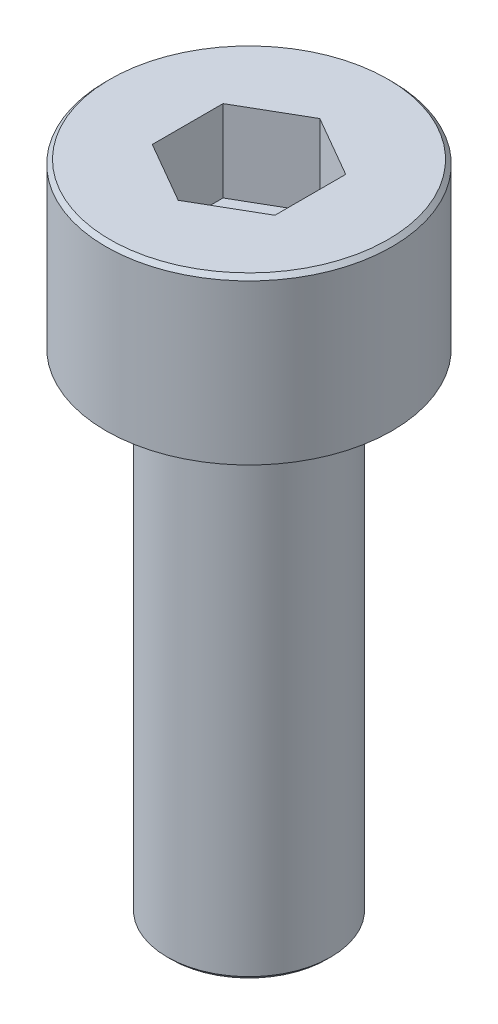
ISO-10303-21;
HEADER;
FILE_DESCRIPTION(('STEP AP214'),'2;1');
FILE_NAME('part.step','',(''),(''),'','','');
FILE_SCHEMA(('AUTOMOTIVE_DESIGN { 1 0 10303 214 1 1 1 1 }'));
ENDSEC;
DATA;
#1=APPLICATION_CONTEXT('core data for automotive mechanical design processes');
#2=APPLICATION_PROTOCOL_DEFINITION('international standard','automotive_design',2000,#1);
#3=PRODUCT_CONTEXT('',#1,'mechanical');
#4=PRODUCT('Part','Part','',(#3));
#5=PRODUCT_RELATED_PRODUCT_CATEGORY('part','',(#4));
#6=PRODUCT_DEFINITION_FORMATION('','',#4);
#7=PRODUCT_DEFINITION_CONTEXT('part definition',#1,'design');
#8=PRODUCT_DEFINITION('design','',#6,#7);
#9=PRODUCT_DEFINITION_SHAPE('','',#8);
#10=(LENGTH_UNIT() NAMED_UNIT(*) SI_UNIT(.MILLI.,.METRE.));
#11=(NAMED_UNIT(*) PLANE_ANGLE_UNIT() SI_UNIT($,.RADIAN.));
#12=(NAMED_UNIT(*) SI_UNIT($,.STERADIAN.) SOLID_ANGLE_UNIT());
#13=UNCERTAINTY_MEASURE_WITH_UNIT(LENGTH_MEASURE(1.E-05),#10,'distance_accuracy_value','');
#14=(GEOMETRIC_REPRESENTATION_CONTEXT(3) GLOBAL_UNCERTAINTY_ASSIGNED_CONTEXT((#13)) GLOBAL_UNIT_ASSIGNED_CONTEXT((#10,
#11,#12)) REPRESENTATION_CONTEXT('',''));
#15=CARTESIAN_POINT('',(0.,0.,0.));
#16=DIRECTION('',(0.,0.,1.));
#17=DIRECTION('',(1.,0.,0.));
#18=AXIS2_PLACEMENT_3D('',#15,#16,#17);
#19=CARTESIAN_POINT('',(2.,-12.,0.));
#20=DIRECTION('',(0.,1.,0.));
#21=DIRECTION('',(0.,0.,1.));
#22=AXIS2_PLACEMENT_3D('',#19,#20,#21);
#23=PLANE('',#22);
#24=CARTESIAN_POINT('',(0.,-12.,0.));
#25=DIRECTION('',(0.,1.,0.));
#26=DIRECTION('',(0.,0.,1.));
#27=AXIS2_PLACEMENT_3D('',#24,#25,#26);
#28=CIRCLE('',#27,1.9);
#29=CARTESIAN_POINT('',(0.,-12.,1.9));
#30=VERTEX_POINT('',#29);
#31=EDGE_CURVE('E11',#30,#30,#28,.F.);
#32=ORIENTED_EDGE('',*,*,#31,.T.);
#33=EDGE_LOOP('',(#32));
#34=FACE_BOUND('',#33,.T.);
#35=ADVANCED_FACE('F34',(#34),#23,.F.);
#36=CARTESIAN_POINT('',(0.,4.,0.));
#37=DIRECTION('',(0.,-1.,0.));
#38=DIRECTION('',(0.,0.,-1.));
#39=AXIS2_PLACEMENT_3D('',#36,#37,#38);
#40=PLANE('',#39);
#41=DIRECTION('',(-0.866025403784439,0.,0.5));
#42=VECTOR('',#41,1.);
#43=CARTESIAN_POINT('',(0.,4.,-1.73205080756888));
#44=LINE('',#43,#42);
#45=CARTESIAN_POINT('',(0.,4.,-1.73205080756888));
#46=VERTEX_POINT('',#45);
#47=CARTESIAN_POINT('',(-1.5,4.,-0.866025403784439));
#48=VERTEX_POINT('',#47);
#49=EDGE_CURVE('E123',#46,#48,#44,.T.);
#50=ORIENTED_EDGE('',*,*,#49,.F.);
#51=DIRECTION('',(-0.866025403784439,0.,-0.5));
#52=VECTOR('',#51,1.);
#53=CARTESIAN_POINT('',(1.5,4.,-0.866025403784439));
#54=LINE('',#53,#52);
#55=CARTESIAN_POINT('',(1.5,4.,-0.866025403784439));
#56=VERTEX_POINT('',#55);
#57=EDGE_CURVE('E49',#56,#46,#54,.T.);
#58=ORIENTED_EDGE('',*,*,#57,.F.);
#59=DIRECTION('',(0.,0.,-1.));
#60=VECTOR('',#59,1.);
#61=CARTESIAN_POINT('',(1.5,4.,0.866025403784439));
#62=LINE('',#61,#60);
#63=CARTESIAN_POINT('',(1.5,4.,0.866025403784439));
#64=VERTEX_POINT('',#63);
#65=EDGE_CURVE('E132',#64,#56,#62,.T.);
#66=ORIENTED_EDGE('',*,*,#65,.F.);
#67=DIRECTION('',(0.866025403784439,0.,-0.5));
#68=VECTOR('',#67,1.);
#69=CARTESIAN_POINT('',(0.,4.,1.73205080756888));
#70=LINE('',#69,#68);
#71=CARTESIAN_POINT('',(0.,4.,1.73205080756888));
#72=VERTEX_POINT('',#71);
#73=EDGE_CURVE('E130',#72,#64,#70,.T.);
#74=ORIENTED_EDGE('',*,*,#73,.F.);
#75=DIRECTION('',(0.866025403784438,0.,0.5));
#76=VECTOR('',#75,1.);
#77=CARTESIAN_POINT('',(-1.5,4.,0.866025403784439));
#78=LINE('',#77,#76);
#79=CARTESIAN_POINT('',(-1.5,4.,0.866025403784439));
#80=VERTEX_POINT('',#79);
#81=EDGE_CURVE('E97',#80,#72,#78,.T.);
#82=ORIENTED_EDGE('',*,*,#81,.F.);
#83=DIRECTION('',(0.,0.,1.));
#84=VECTOR('',#83,1.);
#85=CARTESIAN_POINT('',(-1.5,4.,-0.866025403784439));
#86=LINE('',#85,#84);
#87=EDGE_CURVE('E126',#48,#80,#86,.T.);
#88=ORIENTED_EDGE('',*,*,#87,.F.);
#89=EDGE_LOOP('',(#50,#58,#66,#74,#82,#88));
#90=FACE_BOUND('',#89,.T.);
#91=CARTESIAN_POINT('',(0.,4.,0.));
#92=DIRECTION('',(0.,-1.,0.));
#93=DIRECTION('',(0.,0.,-1.));
#94=AXIS2_PLACEMENT_3D('',#91,#92,#93);
#95=CIRCLE('',#94,3.40000000000001);
#96=CARTESIAN_POINT('',(0.,4.,-3.40000000000001));
#97=VERTEX_POINT('',#96);
#98=EDGE_CURVE('E147',#97,#97,#95,.F.);
#99=ORIENTED_EDGE('',*,*,#98,.T.);
#100=EDGE_LOOP('',(#99));
#101=FACE_BOUND('',#100,.T.);
#102=ADVANCED_FACE('F171',(#90,#101),#40,.F.);
#103=CARTESIAN_POINT('',(0.,28.3884819972091,0.));
#104=DIRECTION('',(0.,1.,0.));
#105=DIRECTION('',(0.,0.,1.));
#106=AXIS2_PLACEMENT_3D('',#103,#104,#105);
#107=CYLINDRICAL_SURFACE('',#106,3.5);
#108=CARTESIAN_POINT('',(0.,3.9,0.));
#109=DIRECTION('',(0.,-1.,0.));
#110=DIRECTION('',(0.,0.,-1.));
#111=AXIS2_PLACEMENT_3D('',#108,#109,#110);
#112=CIRCLE('',#111,3.5);
#113=CARTESIAN_POINT('',(0.,3.9,-3.5));
#114=VERTEX_POINT('',#113);
#115=EDGE_CURVE('E150',#114,#114,#112,.T.);
#116=ORIENTED_EDGE('',*,*,#115,.T.);
#117=EDGE_LOOP('',(#116));
#118=FACE_BOUND('',#117,.T.);
#119=CARTESIAN_POINT('',(0.,0.,0.));
#120=DIRECTION('',(0.,1.,0.));
#121=DIRECTION('',(0.,0.,1.));
#122=AXIS2_PLACEMENT_3D('',#119,#120,#121);
#123=CIRCLE('',#122,3.5);
#124=CARTESIAN_POINT('',(0.,0.,3.5));
#125=VERTEX_POINT('',#124);
#126=EDGE_CURVE('E144',#125,#125,#123,.T.);
#127=ORIENTED_EDGE('',*,*,#126,.T.);
#128=EDGE_LOOP('',(#127));
#129=FACE_BOUND('',#128,.T.);
#130=ADVANCED_FACE('F177',(#118,#129),#107,.T.);
#131=CARTESIAN_POINT('',(3.5,0.,0.));
#132=DIRECTION('',(0.,1.,0.));
#133=DIRECTION('',(0.,0.,1.));
#134=AXIS2_PLACEMENT_3D('',#131,#132,#133);
#135=PLANE('',#134);
#136=ORIENTED_EDGE('',*,*,#126,.F.);
#137=EDGE_LOOP('',(#136));
#138=FACE_BOUND('',#137,.T.);
#139=CARTESIAN_POINT('',(0.,0.,0.));
#140=DIRECTION('',(0.,1.,0.));
#141=DIRECTION('',(0.,0.,1.));
#142=AXIS2_PLACEMENT_3D('',#139,#140,#141);
#143=CIRCLE('',#142,2.);
#144=CARTESIAN_POINT('',(0.,0.,2.));
#145=VERTEX_POINT('',#144);
#146=EDGE_CURVE('E136',#145,#145,#143,.T.);
#147=ORIENTED_EDGE('',*,*,#146,.T.);
#148=EDGE_LOOP('',(#147));
#149=FACE_BOUND('',#148,.T.);
#150=ADVANCED_FACE('F183',(#138,#149),#135,.F.);
#151=CARTESIAN_POINT('',(0.,28.3884819972091,0.));
#152=DIRECTION('',(0.,1.,0.));
#153=DIRECTION('',(0.,0.,1.));
#154=AXIS2_PLACEMENT_3D('',#151,#152,#153);
#155=CYLINDRICAL_SURFACE('',#154,2.);
#156=CARTESIAN_POINT('',(0.,-11.9,0.));
#157=DIRECTION('',(0.,1.,0.));
#158=DIRECTION('',(0.,0.,1.));
#159=AXIS2_PLACEMENT_3D('',#156,#157,#158);
#160=CIRCLE('',#159,2.);
#161=CARTESIAN_POINT('',(0.,-11.9,2.));
#162=VERTEX_POINT('',#161);
#163=EDGE_CURVE('E42',#162,#162,#160,.T.);
#164=ORIENTED_EDGE('',*,*,#163,.T.);
#165=EDGE_LOOP('',(#164));
#166=FACE_BOUND('',#165,.T.);
#167=ORIENTED_EDGE('',*,*,#146,.F.);
#168=EDGE_LOOP('',(#167));
#169=FACE_BOUND('',#168,.T.);
#170=ADVANCED_FACE('F155',(#166,#169),#155,.T.);
#171=CARTESIAN_POINT('',(0.,4.,0.));
#172=DIRECTION('',(0.,-1.,0.));
#173=DIRECTION('',(0.,0.,-1.));
#174=AXIS2_PLACEMENT_3D('',#171,#172,#173);
#175=CONICAL_SURFACE('',#174,3.40000000000001,0.785398163397457);
#176=ORIENTED_EDGE('',*,*,#115,.F.);
#177=EDGE_LOOP('',(#176));
#178=FACE_BOUND('',#177,.T.);
#179=ORIENTED_EDGE('',*,*,#98,.F.);
#180=EDGE_LOOP('',(#179));
#181=FACE_BOUND('',#180,.T.);
#182=ADVANCED_FACE('F160',(#178,#181),#175,.T.);
#183=CARTESIAN_POINT('',(0.,-11.9,0.));
#184=DIRECTION('',(0.,1.,0.));
#185=DIRECTION('',(0.,0.,1.));
#186=AXIS2_PLACEMENT_3D('',#183,#184,#185);
#187=CONICAL_SURFACE('',#186,2.,0.78539816339747);
#188=ORIENTED_EDGE('',*,*,#31,.F.);
#189=EDGE_LOOP('',(#188));
#190=FACE_BOUND('',#189,.T.);
#191=ORIENTED_EDGE('',*,*,#163,.F.);
#192=EDGE_LOOP('',(#191));
#193=FACE_BOUND('',#192,.T.);
#194=ADVANCED_FACE('F36',(#190,#193),#187,.T.);
#195=CARTESIAN_POINT('',(1.5,2.,-0.866025403784439));
#196=DIRECTION('',(0.5,0.,-0.866025403784439));
#197=DIRECTION('',(-0.866025403784439,0.,-0.5));
#198=AXIS2_PLACEMENT_3D('',#195,#196,#197);
#199=PLANE('',#198);
#200=ORIENTED_EDGE('',*,*,#57,.T.);
#201=DIRECTION('',(0.,1.,0.));
#202=VECTOR('',#201,1.);
#203=CARTESIAN_POINT('',(0.,2.,-1.73205080756888));
#204=LINE('',#203,#202);
#205=CARTESIAN_POINT('',(0.,2.,-1.73205080756888));
#206=VERTEX_POINT('',#205);
#207=EDGE_CURVE('E79',#206,#46,#204,.T.);
#208=ORIENTED_EDGE('',*,*,#207,.F.);
#209=DIRECTION('',(-0.866025403784439,0.,-0.5));
#210=VECTOR('',#209,1.);
#211=CARTESIAN_POINT('',(1.5,2.,-0.866025403784439));
#212=LINE('',#211,#210);
#213=CARTESIAN_POINT('',(1.5,2.,-0.866025403784439));
#214=VERTEX_POINT('',#213);
#215=EDGE_CURVE('E134',#214,#206,#212,.T.);
#216=ORIENTED_EDGE('',*,*,#215,.F.);
#217=DIRECTION('',(0.,1.,0.));
#218=VECTOR('',#217,1.);
#219=CARTESIAN_POINT('',(1.5,2.,-0.866025403784439));
#220=LINE('',#219,#218);
#221=EDGE_CURVE('E57',#214,#56,#220,.T.);
#222=ORIENTED_EDGE('',*,*,#221,.T.);
#223=EDGE_LOOP('',(#200,#208,#216,#222));
#224=FACE_BOUND('',#223,.T.);
#225=ADVANCED_FACE('F159',(#224),#199,.F.);
#226=CARTESIAN_POINT('',(1.5,2.,0.866025403784439));
#227=DIRECTION('',(1.,0.,0.));
#228=DIRECTION('',(0.,0.,-1.));
#229=AXIS2_PLACEMENT_3D('',#226,#227,#228);
#230=PLANE('',#229);
#231=ORIENTED_EDGE('',*,*,#65,.T.);
#232=ORIENTED_EDGE('',*,*,#221,.F.);
#233=DIRECTION('',(0.,0.,-1.));
#234=VECTOR('',#233,1.);
#235=CARTESIAN_POINT('',(1.5,2.,0.866025403784439));
#236=LINE('',#235,#234);
#237=CARTESIAN_POINT('',(1.5,2.,0.866025403784439));
#238=VERTEX_POINT('',#237);
#239=EDGE_CURVE('E109',#238,#214,#236,.T.);
#240=ORIENTED_EDGE('',*,*,#239,.F.);
#241=DIRECTION('',(0.,1.,0.));
#242=VECTOR('',#241,1.);
#243=CARTESIAN_POINT('',(1.5,2.,0.866025403784439));
#244=LINE('',#243,#242);
#245=EDGE_CURVE('E101',#238,#64,#244,.T.);
#246=ORIENTED_EDGE('',*,*,#245,.T.);
#247=EDGE_LOOP('',(#231,#232,#240,#246));
#248=FACE_BOUND('',#247,.T.);
#249=ADVANCED_FACE('F166',(#248),#230,.F.);
#250=CARTESIAN_POINT('',(0.,2.,1.73205080756888));
#251=DIRECTION('',(0.5,0.,0.866025403784439));
#252=DIRECTION('',(0.866025403784439,0.,-0.5));
#253=AXIS2_PLACEMENT_3D('',#250,#251,#252);
#254=PLANE('',#253);
#255=ORIENTED_EDGE('',*,*,#73,.T.);
#256=ORIENTED_EDGE('',*,*,#245,.F.);
#257=DIRECTION('',(0.866025403784439,0.,-0.5));
#258=VECTOR('',#257,1.);
#259=CARTESIAN_POINT('',(0.,2.,1.73205080756888));
#260=LINE('',#259,#258);
#261=CARTESIAN_POINT('',(0.,2.,1.73205080756888));
#262=VERTEX_POINT('',#261);
#263=EDGE_CURVE('E105',#262,#238,#260,.T.);
#264=ORIENTED_EDGE('',*,*,#263,.F.);
#265=DIRECTION('',(0.,1.,0.));
#266=VECTOR('',#265,1.);
#267=CARTESIAN_POINT('',(0.,2.,1.73205080756888));
#268=LINE('',#267,#266);
#269=EDGE_CURVE('E90',#262,#72,#268,.T.);
#270=ORIENTED_EDGE('',*,*,#269,.T.);
#271=EDGE_LOOP('',(#255,#256,#264,#270));
#272=FACE_BOUND('',#271,.T.);
#273=ADVANCED_FACE('F106',(#272),#254,.F.);
#274=CARTESIAN_POINT('',(-1.5,2.,0.866025403784439));
#275=DIRECTION('',(-0.5,0.,0.866025403784439));
#276=DIRECTION('',(0.866025403784438,0.,0.5));
#277=AXIS2_PLACEMENT_3D('',#274,#275,#276);
#278=PLANE('',#277);
#279=ORIENTED_EDGE('',*,*,#81,.T.);
#280=ORIENTED_EDGE('',*,*,#269,.F.);
#281=DIRECTION('',(0.866025403784438,0.,0.5));
#282=VECTOR('',#281,1.);
#283=CARTESIAN_POINT('',(-1.5,2.,0.866025403784439));
#284=LINE('',#283,#282);
#285=CARTESIAN_POINT('',(-1.5,2.,0.866025403784439));
#286=VERTEX_POINT('',#285);
#287=EDGE_CURVE('E94',#286,#262,#284,.T.);
#288=ORIENTED_EDGE('',*,*,#287,.F.);
#289=DIRECTION('',(0.,1.,0.));
#290=VECTOR('',#289,1.);
#291=CARTESIAN_POINT('',(-1.5,2.,0.866025403784439));
#292=LINE('',#291,#290);
#293=EDGE_CURVE('E102',#286,#80,#292,.T.);
#294=ORIENTED_EDGE('',*,*,#293,.T.);
#295=EDGE_LOOP('',(#279,#280,#288,#294));
#296=FACE_BOUND('',#295,.T.);
#297=ADVANCED_FACE('F92',(#296),#278,.F.);
#298=CARTESIAN_POINT('',(-1.5,2.,-0.866025403784439));
#299=DIRECTION('',(-1.,0.,0.));
#300=DIRECTION('',(0.,0.,1.));
#301=AXIS2_PLACEMENT_3D('',#298,#299,#300);
#302=PLANE('',#301);
#303=ORIENTED_EDGE('',*,*,#87,.T.);
#304=ORIENTED_EDGE('',*,*,#293,.F.);
#305=DIRECTION('',(0.,0.,1.));
#306=VECTOR('',#305,1.);
#307=CARTESIAN_POINT('',(-1.5,2.,-0.866025403784439));
#308=LINE('',#307,#306);
#309=CARTESIAN_POINT('',(-1.5,2.,-0.866025403784439));
#310=VERTEX_POINT('',#309);
#311=EDGE_CURVE('E115',#310,#286,#308,.T.);
#312=ORIENTED_EDGE('',*,*,#311,.F.);
#313=DIRECTION('',(0.,1.,0.));
#314=VECTOR('',#313,1.);
#315=CARTESIAN_POINT('',(-1.5,2.,-0.866025403784439));
#316=LINE('',#315,#314);
#317=EDGE_CURVE('E139',#310,#48,#316,.T.);
#318=ORIENTED_EDGE('',*,*,#317,.T.);
#319=EDGE_LOOP('',(#303,#304,#312,#318));
#320=FACE_BOUND('',#319,.T.);
#321=ADVANCED_FACE('F193',(#320),#302,.F.);
#322=CARTESIAN_POINT('',(0.,2.,-1.73205080756888));
#323=DIRECTION('',(-0.5,0.,-0.866025403784439));
#324=DIRECTION('',(-0.866025403784439,0.,0.5));
#325=AXIS2_PLACEMENT_3D('',#322,#323,#324);
#326=PLANE('',#325);
#327=ORIENTED_EDGE('',*,*,#49,.T.);
#328=ORIENTED_EDGE('',*,*,#317,.F.);
#329=DIRECTION('',(-0.866025403784439,0.,0.5));
#330=VECTOR('',#329,1.);
#331=CARTESIAN_POINT('',(0.,2.,-1.73205080756888));
#332=LINE('',#331,#330);
#333=EDGE_CURVE('E117',#206,#310,#332,.T.);
#334=ORIENTED_EDGE('',*,*,#333,.F.);
#335=ORIENTED_EDGE('',*,*,#207,.T.);
#336=EDGE_LOOP('',(#327,#328,#334,#335));
#337=FACE_BOUND('',#336,.T.);
#338=ADVANCED_FACE('F190',(#337),#326,.F.);
#339=CARTESIAN_POINT('',(0.,2.,-1.73205080756888));
#340=DIRECTION('',(0.,1.,0.));
#341=DIRECTION('',(0.,0.,1.));
#342=AXIS2_PLACEMENT_3D('',#339,#340,#341);
#343=PLANE('',#342);
#344=ORIENTED_EDGE('',*,*,#215,.T.);
#345=ORIENTED_EDGE('',*,*,#333,.T.);
#346=ORIENTED_EDGE('',*,*,#311,.T.);
#347=ORIENTED_EDGE('',*,*,#287,.T.);
#348=ORIENTED_EDGE('',*,*,#263,.T.);
#349=ORIENTED_EDGE('',*,*,#239,.T.);
#350=EDGE_LOOP('',(#344,#345,#346,#347,#348,#349));
#351=FACE_BOUND('',#350,.T.);
#352=ADVANCED_FACE('F112',(#351),#343,.T.);
#353=CLOSED_SHELL('',(#35,#102,#130,#150,#170,#182,#194,#225,#249,#273,#297,#321,#338,#352));
#354=MANIFOLD_SOLID_BREP('B2',#353);
#355=ADVANCED_BREP_SHAPE_REPRESENTATION('',(#18,#354),#14);
#356=SHAPE_DEFINITION_REPRESENTATION(#9,#355);
ENDSEC;
END-ISO-10303-21;
